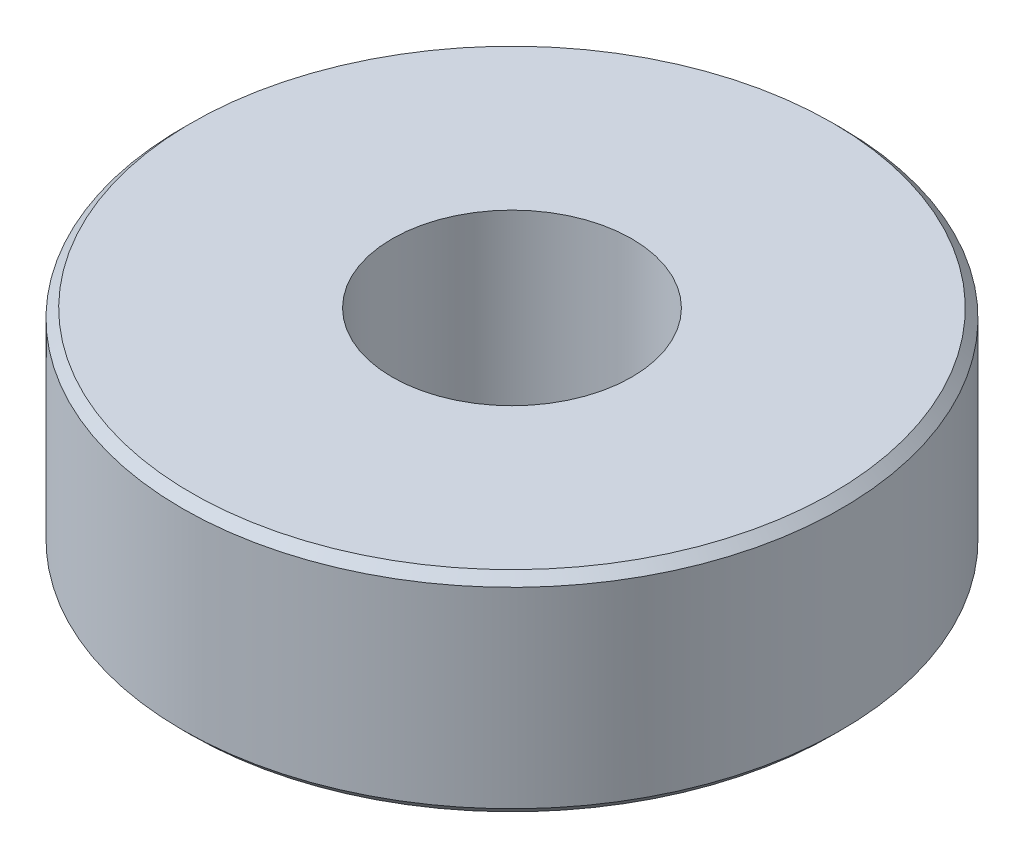
ISO-10303-21;
HEADER;
FILE_DESCRIPTION(('STEP AP214'),'2;1');
FILE_NAME('part.step','',(''),(''),'','','');
FILE_SCHEMA(('AUTOMOTIVE_DESIGN { 1 0 10303 214 1 1 1 1 }'));
ENDSEC;
DATA;
#1=APPLICATION_CONTEXT('core data for automotive mechanical design processes');
#2=APPLICATION_PROTOCOL_DEFINITION('international standard','automotive_design',2000,#1);
#3=PRODUCT_CONTEXT('',#1,'mechanical');
#4=PRODUCT('Part','Part','',(#3));
#5=PRODUCT_RELATED_PRODUCT_CATEGORY('part','',(#4));
#6=PRODUCT_DEFINITION_FORMATION('','',#4);
#7=PRODUCT_DEFINITION_CONTEXT('part definition',#1,'design');
#8=PRODUCT_DEFINITION('design','',#6,#7);
#9=PRODUCT_DEFINITION_SHAPE('','',#8);
#10=(LENGTH_UNIT() NAMED_UNIT(*) SI_UNIT(.MILLI.,.METRE.));
#11=(NAMED_UNIT(*) PLANE_ANGLE_UNIT() SI_UNIT($,.RADIAN.));
#12=(NAMED_UNIT(*) SI_UNIT($,.STERADIAN.) SOLID_ANGLE_UNIT());
#13=UNCERTAINTY_MEASURE_WITH_UNIT(LENGTH_MEASURE(1.E-05),#10,'distance_accuracy_value','');
#14=(GEOMETRIC_REPRESENTATION_CONTEXT(3) GLOBAL_UNCERTAINTY_ASSIGNED_CONTEXT((#13)) GLOBAL_UNIT_ASSIGNED_CONTEXT((#10,
#11,#12)) REPRESENTATION_CONTEXT('',''));
#15=CARTESIAN_POINT('',(0.,0.,0.));
#16=DIRECTION('',(0.,0.,1.));
#17=DIRECTION('',(1.,0.,0.));
#18=AXIS2_PLACEMENT_3D('',#15,#16,#17);
#19=CARTESIAN_POINT('',(0.,-3.5,0.));
#20=DIRECTION('',(0.,1.,0.));
#21=DIRECTION('',(0.,0.,1.));
#22=AXIS2_PLACEMENT_3D('',#19,#20,#21);
#23=CYLINDRICAL_SURFACE('',#22,11.);
#24=CARTESIAN_POINT('',(0.,-3.2,0.));
#25=DIRECTION('',(0.,1.,0.));
#26=DIRECTION('',(0.,0.,1.));
#27=AXIS2_PLACEMENT_3D('',#24,#25,#26);
#28=CIRCLE('',#27,11.);
#29=CARTESIAN_POINT('',(0.,-3.2,11.));
#30=VERTEX_POINT('',#29);
#31=EDGE_CURVE('E42',#30,#30,#28,.T.);
#32=ORIENTED_EDGE('',*,*,#31,.T.);
#33=EDGE_LOOP('',(#32));
#34=FACE_BOUND('',#33,.T.);
#35=CARTESIAN_POINT('',(0.,3.19999999999999,0.));
#36=DIRECTION('',(0.,1.,0.));
#37=DIRECTION('',(0.,0.,1.));
#38=AXIS2_PLACEMENT_3D('',#35,#36,#37);
#39=CIRCLE('',#38,11.);
#40=CARTESIAN_POINT('',(0.,3.19999999999999,-11.));
#41=VERTEX_POINT('',#40);
#42=EDGE_CURVE('E46',#41,#41,#39,.F.);
#43=ORIENTED_EDGE('',*,*,#42,.T.);
#44=EDGE_LOOP('',(#43));
#45=FACE_BOUND('',#44,.T.);
#46=ADVANCED_FACE('F31',(#34,#45),#23,.T.);
#47=CARTESIAN_POINT('',(0.,-3.5,0.));
#48=DIRECTION('',(0.,1.,0.));
#49=DIRECTION('',(0.,0.,1.));
#50=AXIS2_PLACEMENT_3D('',#47,#48,#49);
#51=PLANE('',#50);
#52=CARTESIAN_POINT('',(0.,-3.5,0.));
#53=DIRECTION('',(0.,1.,0.));
#54=DIRECTION('',(0.,0.,1.));
#55=AXIS2_PLACEMENT_3D('',#52,#53,#54);
#56=CIRCLE('',#55,10.7);
#57=CARTESIAN_POINT('',(0.,-3.5,10.7));
#58=VERTEX_POINT('',#57);
#59=EDGE_CURVE('E38',#58,#58,#56,.F.);
#60=ORIENTED_EDGE('',*,*,#59,.T.);
#61=EDGE_LOOP('',(#60));
#62=FACE_BOUND('',#61,.T.);
#63=CARTESIAN_POINT('',(0.,-3.5,0.));
#64=DIRECTION('',(0.,1.,0.));
#65=DIRECTION('',(0.,0.,1.));
#66=AXIS2_PLACEMENT_3D('',#63,#64,#65);
#67=CIRCLE('',#66,4.);
#68=CARTESIAN_POINT('',(0.,-3.5,4.));
#69=VERTEX_POINT('',#68);
#70=EDGE_CURVE('E51',#69,#69,#67,.T.);
#71=ORIENTED_EDGE('',*,*,#70,.T.);
#72=EDGE_LOOP('',(#71));
#73=FACE_BOUND('',#72,.T.);
#74=ADVANCED_FACE('F69',(#62,#73),#51,.F.);
#75=CARTESIAN_POINT('',(0.,-3.5,0.));
#76=DIRECTION('',(0.,1.,0.));
#77=DIRECTION('',(0.,0.,1.));
#78=AXIS2_PLACEMENT_3D('',#75,#76,#77);
#79=CYLINDRICAL_SURFACE('',#78,4.);
#80=ORIENTED_EDGE('',*,*,#70,.F.);
#81=EDGE_LOOP('',(#80));
#82=FACE_BOUND('',#81,.T.);
#83=CARTESIAN_POINT('',(0.,3.5,0.));
#84=DIRECTION('',(0.,1.,0.));
#85=DIRECTION('',(0.,0.,1.));
#86=AXIS2_PLACEMENT_3D('',#83,#84,#85);
#87=CIRCLE('',#86,4.);
#88=CARTESIAN_POINT('',(0.,3.5,4.));
#89=VERTEX_POINT('',#88);
#90=EDGE_CURVE('E54',#89,#89,#87,.T.);
#91=ORIENTED_EDGE('',*,*,#90,.T.);
#92=EDGE_LOOP('',(#91));
#93=FACE_BOUND('',#92,.T.);
#94=ADVANCED_FACE('F58',(#82,#93),#79,.F.);
#95=CARTESIAN_POINT('',(0.,3.5,0.));
#96=DIRECTION('',(0.,1.,0.));
#97=DIRECTION('',(0.,0.,1.));
#98=AXIS2_PLACEMENT_3D('',#95,#96,#97);
#99=PLANE('',#98);
#100=CARTESIAN_POINT('',(0.,3.5,0.));
#101=DIRECTION('',(0.,1.,0.));
#102=DIRECTION('',(0.,0.,1.));
#103=AXIS2_PLACEMENT_3D('',#100,#101,#102);
#104=CIRCLE('',#103,10.7);
#105=CARTESIAN_POINT('',(0.,3.5,-10.7));
#106=VERTEX_POINT('',#105);
#107=EDGE_CURVE('E10',#106,#106,#104,.T.);
#108=ORIENTED_EDGE('',*,*,#107,.T.);
#109=EDGE_LOOP('',(#108));
#110=FACE_BOUND('',#109,.T.);
#111=ORIENTED_EDGE('',*,*,#90,.F.);
#112=EDGE_LOOP('',(#111));
#113=FACE_BOUND('',#112,.T.);
#114=ADVANCED_FACE('F60',(#110,#113),#99,.T.);
#115=CARTESIAN_POINT('',(0.,-3.2,0.));
#116=DIRECTION('',(0.,1.,0.));
#117=DIRECTION('',(0.,0.,1.));
#118=AXIS2_PLACEMENT_3D('',#115,#116,#117);
#119=CONICAL_SURFACE('',#118,11.,0.785398163397451);
#120=ORIENTED_EDGE('',*,*,#59,.F.);
#121=EDGE_LOOP('',(#120));
#122=FACE_BOUND('',#121,.T.);
#123=ORIENTED_EDGE('',*,*,#31,.F.);
#124=EDGE_LOOP('',(#123));
#125=FACE_BOUND('',#124,.T.);
#126=ADVANCED_FACE('F62',(#122,#125),#119,.T.);
#127=CARTESIAN_POINT('',(0.,3.5,0.));
#128=DIRECTION('',(0.,-1.,0.));
#129=DIRECTION('',(0.,0.,-1.));
#130=AXIS2_PLACEMENT_3D('',#127,#128,#129);
#131=CONICAL_SURFACE('',#130,10.7,0.785398163397437);
#132=CARTESIAN_POINT('',(0.,3.19999999999999,-11.));
#133=CARTESIAN_POINT('',(0.,3.203125,-10.996875));
#134=CARTESIAN_POINT('',(0.,3.20624999999999,-10.99375));
#135=CARTESIAN_POINT('',(0.,3.2125,-10.9875));
#136=CARTESIAN_POINT('',(0.,3.21562499999999,-10.984375));
#137=CARTESIAN_POINT('',(0.,3.22187499999999,-10.978125));
#138=CARTESIAN_POINT('',(0.,3.225,-10.975));
#139=CARTESIAN_POINT('',(0.,3.23125,-10.96875));
#140=CARTESIAN_POINT('',(0.,3.234375,-10.965625));
#141=CARTESIAN_POINT('',(0.,3.240625,-10.959375));
#142=CARTESIAN_POINT('',(0.,3.24375,-10.95625));
#143=CARTESIAN_POINT('',(0.,3.25,-10.95));
#144=CARTESIAN_POINT('',(0.,3.253125,-10.946875));
#145=CARTESIAN_POINT('',(0.,3.259375,-10.940625));
#146=CARTESIAN_POINT('',(0.,3.2625,-10.9375));
#147=CARTESIAN_POINT('',(0.,3.26875,-10.93125));
#148=CARTESIAN_POINT('',(0.,3.271875,-10.928125));
#149=CARTESIAN_POINT('',(0.,3.278125,-10.921875));
#150=CARTESIAN_POINT('',(0.,3.28125,-10.91875));
#151=CARTESIAN_POINT('',(0.,3.2875,-10.9125));
#152=CARTESIAN_POINT('',(0.,3.290625,-10.909375));
#153=CARTESIAN_POINT('',(0.,3.296875,-10.903125));
#154=CARTESIAN_POINT('',(0.,3.3,-10.9));
#155=CARTESIAN_POINT('',(0.,3.30625,-10.89375));
#156=CARTESIAN_POINT('',(0.,3.309375,-10.890625));
#157=CARTESIAN_POINT('',(0.,3.315625,-10.884375));
#158=CARTESIAN_POINT('',(0.,3.31875,-10.88125));
#159=CARTESIAN_POINT('',(0.,3.325,-10.875));
#160=CARTESIAN_POINT('',(0.,3.328125,-10.871875));
#161=CARTESIAN_POINT('',(0.,3.334375,-10.865625));
#162=CARTESIAN_POINT('',(0.,3.3375,-10.8625));
#163=CARTESIAN_POINT('',(0.,3.34375,-10.85625));
#164=CARTESIAN_POINT('',(0.,3.346875,-10.853125));
#165=CARTESIAN_POINT('',(0.,3.353125,-10.846875));
#166=CARTESIAN_POINT('',(0.,3.35625,-10.84375));
#167=CARTESIAN_POINT('',(0.,3.3625,-10.8375));
#168=CARTESIAN_POINT('',(0.,3.365625,-10.834375));
#169=CARTESIAN_POINT('',(0.,3.371875,-10.828125));
#170=CARTESIAN_POINT('',(0.,3.375,-10.825));
#171=CARTESIAN_POINT('',(0.,3.38125,-10.81875));
#172=CARTESIAN_POINT('',(0.,3.384375,-10.815625));
#173=CARTESIAN_POINT('',(0.,3.390625,-10.809375));
#174=CARTESIAN_POINT('',(0.,3.39375,-10.80625));
#175=CARTESIAN_POINT('',(0.,3.4,-10.8));
#176=CARTESIAN_POINT('',(0.,3.403125,-10.796875));
#177=CARTESIAN_POINT('',(0.,3.409375,-10.790625));
#178=CARTESIAN_POINT('',(0.,3.4125,-10.7875));
#179=CARTESIAN_POINT('',(0.,3.41875,-10.78125));
#180=CARTESIAN_POINT('',(0.,3.421875,-10.778125));
#181=CARTESIAN_POINT('',(0.,3.428125,-10.771875));
#182=CARTESIAN_POINT('',(0.,3.43125,-10.76875));
#183=CARTESIAN_POINT('',(0.,3.4375,-10.7625));
#184=CARTESIAN_POINT('',(0.,3.440625,-10.759375));
#185=CARTESIAN_POINT('',(0.,3.446875,-10.753125));
#186=CARTESIAN_POINT('',(0.,3.45,-10.75));
#187=CARTESIAN_POINT('',(0.,3.45625,-10.74375));
#188=CARTESIAN_POINT('',(0.,3.459375,-10.740625));
#189=CARTESIAN_POINT('',(0.,3.465625,-10.734375));
#190=CARTESIAN_POINT('',(0.,3.46875,-10.73125));
#191=CARTESIAN_POINT('',(0.,3.475,-10.725));
#192=CARTESIAN_POINT('',(0.,3.478125,-10.721875));
#193=CARTESIAN_POINT('',(0.,3.484375,-10.715625));
#194=CARTESIAN_POINT('',(0.,3.4875,-10.7125));
#195=CARTESIAN_POINT('',(0.,3.49375,-10.70625));
#196=CARTESIAN_POINT('',(0.,3.496875,-10.703125));
#197=CARTESIAN_POINT('',(0.,3.5,-10.7));
#198=B_SPLINE_CURVE_WITH_KNOTS('',3,(#132,#133,#134,#135,#136,#137,#138,#139,#140,#141,#142,
#143,#144,#145,#146,#147,#148,#149,#150,#151,#152,#153,#154,#155,#156,#157,#158,#159,#160,#161,
#162,#163,#164,#165,#166,#167,#168,#169,#170,#171,#172,#173,#174,#175,#176,#177,#178,#179,#180,
#181,#182,#183,#184,#185,#186,#187,#188,#189,#190,#191,#192,#193,#194,#195,#196,#197),
.UNSPECIFIED.,.F.,.F.,(4,2,2,2,2,2,2,2,2,2,2,2,2,2,2,2,2,2,2,2,2,2,2,2,2,2,2,2,2,2,2,2,4),(0.,
0.0132582521472469,0.0265165042944954,0.0397747564417438,0.0530330085889911,0.0662912607362392,
0.0795495128834864,0.0928077650307349,0.106066017177982,0.11932426932523,0.132582521472479,
0.145840773619726,0.159099025766974,0.172357277914221,0.18561553006147,0.198873782208717,
0.212132034355965,0.225390286503212,0.238648538650461,0.251906790797709,0.265165042944957,
0.278423295092205,0.291681547239452,0.3049397993867,0.318198051533948,0.331456303681196,
0.344714555828444,0.357972807975691,0.37123106012294,0.384489312270187,0.397747564417435,
0.411005816564682,0.424264068711931),.UNSPECIFIED.);
#199=EDGE_CURVE('BSEAM33',#41,#106,#198,.T.);
#200=ORIENTED_EDGE('',*,*,#42,.F.);
#201=ORIENTED_EDGE('',*,*,#107,.F.);
#202=ORIENTED_EDGE('',*,*,#199,.T.);
#203=ORIENTED_EDGE('',*,*,#199,.F.);
#204=EDGE_LOOP('',(#200,#202,#201,#203));
#205=FACE_BOUND('',#204,.T.);
#206=ADVANCED_FACE('F33',(#205),#131,.T.);
#207=CLOSED_SHELL('',(#46,#74,#94,#114,#126,#206));
#208=MANIFOLD_SOLID_BREP('B2',#207);
#209=ADVANCED_BREP_SHAPE_REPRESENTATION('',(#18,#208),#14);
#210=SHAPE_DEFINITION_REPRESENTATION(#9,#209);
ENDSEC;
END-ISO-10303-21;
